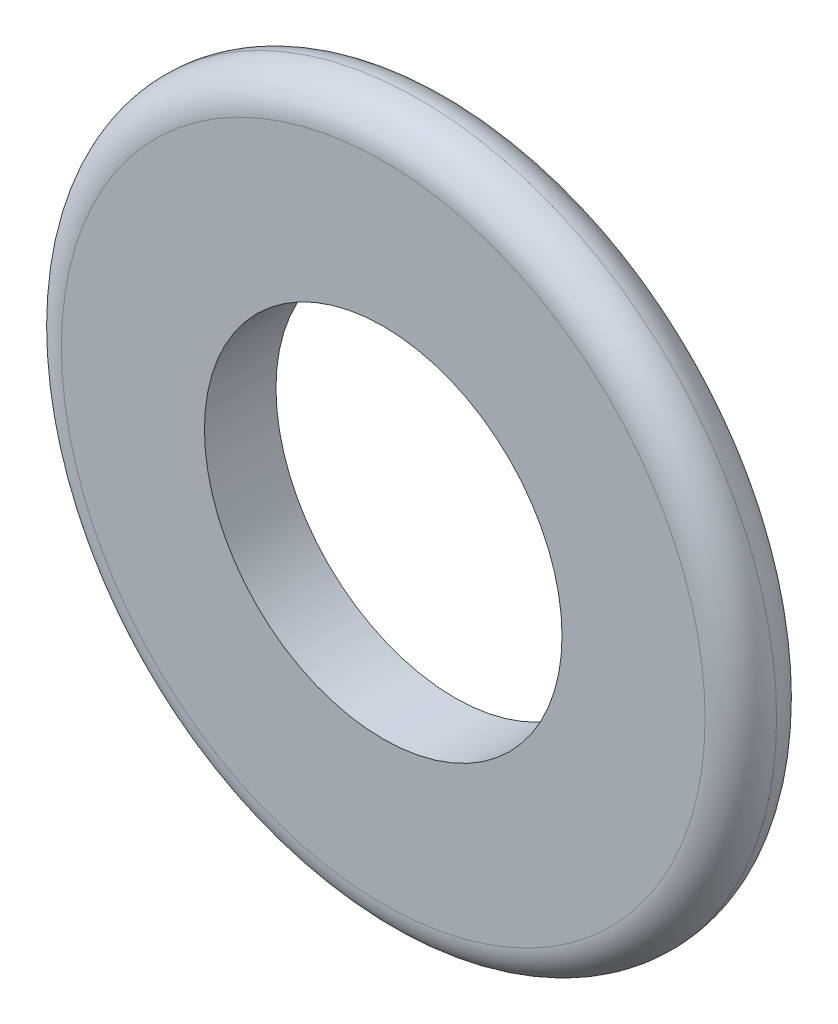
ISO-10303-21;
HEADER;
FILE_DESCRIPTION(('STEP AP214'),'2;1');
FILE_NAME('part.step','',(''),(''),'','','');
FILE_SCHEMA(('AUTOMOTIVE_DESIGN { 1 0 10303 214 1 1 1 1 }'));
ENDSEC;
DATA;
#1=APPLICATION_CONTEXT('core data for automotive mechanical design processes');
#2=APPLICATION_PROTOCOL_DEFINITION('international standard','automotive_design',2000,#1);
#3=PRODUCT_CONTEXT('',#1,'mechanical');
#4=PRODUCT('Part','Part','',(#3));
#5=PRODUCT_RELATED_PRODUCT_CATEGORY('part','',(#4));
#6=PRODUCT_DEFINITION_FORMATION('','',#4);
#7=PRODUCT_DEFINITION_CONTEXT('part definition',#1,'design');
#8=PRODUCT_DEFINITION('design','',#6,#7);
#9=PRODUCT_DEFINITION_SHAPE('','',#8);
#10=(LENGTH_UNIT() NAMED_UNIT(*) SI_UNIT(.MILLI.,.METRE.));
#11=(NAMED_UNIT(*) PLANE_ANGLE_UNIT() SI_UNIT($,.RADIAN.));
#12=(NAMED_UNIT(*) SI_UNIT($,.STERADIAN.) SOLID_ANGLE_UNIT());
#13=UNCERTAINTY_MEASURE_WITH_UNIT(LENGTH_MEASURE(1.E-05),#10,'distance_accuracy_value','');
#14=(GEOMETRIC_REPRESENTATION_CONTEXT(3) GLOBAL_UNCERTAINTY_ASSIGNED_CONTEXT((#13)) GLOBAL_UNIT_ASSIGNED_CONTEXT((#10,
#11,#12)) REPRESENTATION_CONTEXT('',''));
#15=CARTESIAN_POINT('',(0.,0.,0.));
#16=DIRECTION('',(0.,0.,1.));
#17=DIRECTION('',(1.,0.,0.));
#18=AXIS2_PLACEMENT_3D('',#15,#16,#17);
#19=CARTESIAN_POINT('',(0.,0.,1.));
#20=DIRECTION('',(0.,0.,1.));
#21=DIRECTION('',(1.,0.,0.));
#22=AXIS2_PLACEMENT_3D('',#19,#20,#21);
#23=PLANE('',#22);
#24=CARTESIAN_POINT('',(0.,0.,1.));
#25=DIRECTION('',(0.,0.,1.));
#26=DIRECTION('',(1.,0.,0.));
#27=AXIS2_PLACEMENT_3D('',#24,#25,#26);
#28=CIRCLE('',#27,4.5);
#29=CARTESIAN_POINT('',(4.5,0.,1.));
#30=VERTEX_POINT('',#29);
#31=EDGE_CURVE('E10',#30,#30,#28,.T.);
#32=ORIENTED_EDGE('',*,*,#31,.T.);
#33=EDGE_LOOP('',(#32));
#34=FACE_BOUND('',#33,.T.);
#35=CARTESIAN_POINT('',(0.,0.,1.));
#36=DIRECTION('',(0.,0.,1.));
#37=DIRECTION('',(1.,0.,0.));
#38=AXIS2_PLACEMENT_3D('',#35,#36,#37);
#39=CIRCLE('',#38,2.5);
#40=CARTESIAN_POINT('',(2.5,0.,1.));
#41=VERTEX_POINT('',#40);
#42=EDGE_CURVE('E42',#41,#41,#39,.T.);
#43=ORIENTED_EDGE('',*,*,#42,.F.);
#44=EDGE_LOOP('',(#43));
#45=FACE_BOUND('',#44,.T.);
#46=ADVANCED_FACE('F30',(#34,#45),#23,.T.);
#47=CARTESIAN_POINT('',(0.,0.,0.));
#48=DIRECTION('',(0.,0.,1.));
#49=DIRECTION('',(1.,0.,0.));
#50=AXIS2_PLACEMENT_3D('',#47,#48,#49);
#51=PLANE('',#50);
#52=CARTESIAN_POINT('',(0.,0.,0.));
#53=DIRECTION('',(0.,0.,1.));
#54=DIRECTION('',(1.,0.,0.));
#55=AXIS2_PLACEMENT_3D('',#52,#53,#54);
#56=CIRCLE('',#55,4.5);
#57=CARTESIAN_POINT('',(4.5,0.,0.));
#58=VERTEX_POINT('',#57);
#59=EDGE_CURVE('E38',#58,#58,#56,.F.);
#60=ORIENTED_EDGE('',*,*,#59,.T.);
#61=EDGE_LOOP('',(#60));
#62=FACE_BOUND('',#61,.T.);
#63=CARTESIAN_POINT('',(0.,0.,0.));
#64=DIRECTION('',(0.,0.,1.));
#65=DIRECTION('',(1.,0.,0.));
#66=AXIS2_PLACEMENT_3D('',#63,#64,#65);
#67=CIRCLE('',#66,2.5);
#68=CARTESIAN_POINT('',(2.5,0.,0.));
#69=VERTEX_POINT('',#68);
#70=EDGE_CURVE('E45',#69,#69,#67,.T.);
#71=ORIENTED_EDGE('',*,*,#70,.T.);
#72=EDGE_LOOP('',(#71));
#73=FACE_BOUND('',#72,.T.);
#74=ADVANCED_FACE('F55',(#62,#73),#51,.F.);
#75=CARTESIAN_POINT('',(0.,0.,1.));
#76=DIRECTION('',(0.,0.,-1.));
#77=DIRECTION('',(-1.,0.,0.));
#78=AXIS2_PLACEMENT_3D('',#75,#76,#77);
#79=CYLINDRICAL_SURFACE('',#78,2.5);
#80=ORIENTED_EDGE('',*,*,#42,.T.);
#81=EDGE_LOOP('',(#80));
#82=FACE_BOUND('',#81,.T.);
#83=ORIENTED_EDGE('',*,*,#70,.F.);
#84=EDGE_LOOP('',(#83));
#85=FACE_BOUND('',#84,.T.);
#86=ADVANCED_FACE('F51',(#82,#85),#79,.F.);
#87=CARTESIAN_POINT('',(0.,0.,0.5));
#88=DIRECTION('',(0.,0.,1.));
#89=DIRECTION('',(1.,0.,0.));
#90=AXIS2_PLACEMENT_3D('',#87,#88,#89);
#91=TOROIDAL_SURFACE('',#90,4.5,0.5);
#92=ORIENTED_EDGE('',*,*,#31,.F.);
#93=EDGE_LOOP('',(#92));
#94=FACE_BOUND('',#93,.T.);
#95=CARTESIAN_POINT('',(0.,0.,0.5));
#96=DIRECTION('',(0.,0.,1.));
#97=DIRECTION('',(1.,0.,0.));
#98=AXIS2_PLACEMENT_3D('',#95,#96,#97);
#99=CIRCLE('',#98,5.);
#100=CARTESIAN_POINT('',(5.,0.,0.5));
#101=VERTEX_POINT('',#100);
#102=EDGE_CURVE('E34',#101,#101,#99,.F.);
#103=ORIENTED_EDGE('',*,*,#102,.F.);
#104=EDGE_LOOP('',(#103));
#105=FACE_BOUND('',#104,.T.);
#106=ADVANCED_FACE('F32',(#94,#105),#91,.T.);
#107=CARTESIAN_POINT('',(0.,0.,0.5));
#108=DIRECTION('',(0.,0.,1.));
#109=DIRECTION('',(1.,0.,0.));
#110=AXIS2_PLACEMENT_3D('',#107,#108,#109);
#111=TOROIDAL_SURFACE('',#110,4.5,0.5);
#112=ORIENTED_EDGE('',*,*,#59,.F.);
#113=EDGE_LOOP('',(#112));
#114=FACE_BOUND('',#113,.T.);
#115=ORIENTED_EDGE('',*,*,#102,.T.);
#116=EDGE_LOOP('',(#115));
#117=FACE_BOUND('',#116,.T.);
#118=ADVANCED_FACE('F63',(#114,#117),#111,.T.);
#119=CLOSED_SHELL('',(#46,#74,#86,#106,#118));
#120=MANIFOLD_SOLID_BREP('B2',#119);
#121=ADVANCED_BREP_SHAPE_REPRESENTATION('',(#18,#120),#14);
#122=SHAPE_DEFINITION_REPRESENTATION(#9,#121);
ENDSEC;
END-ISO-10303-21;
